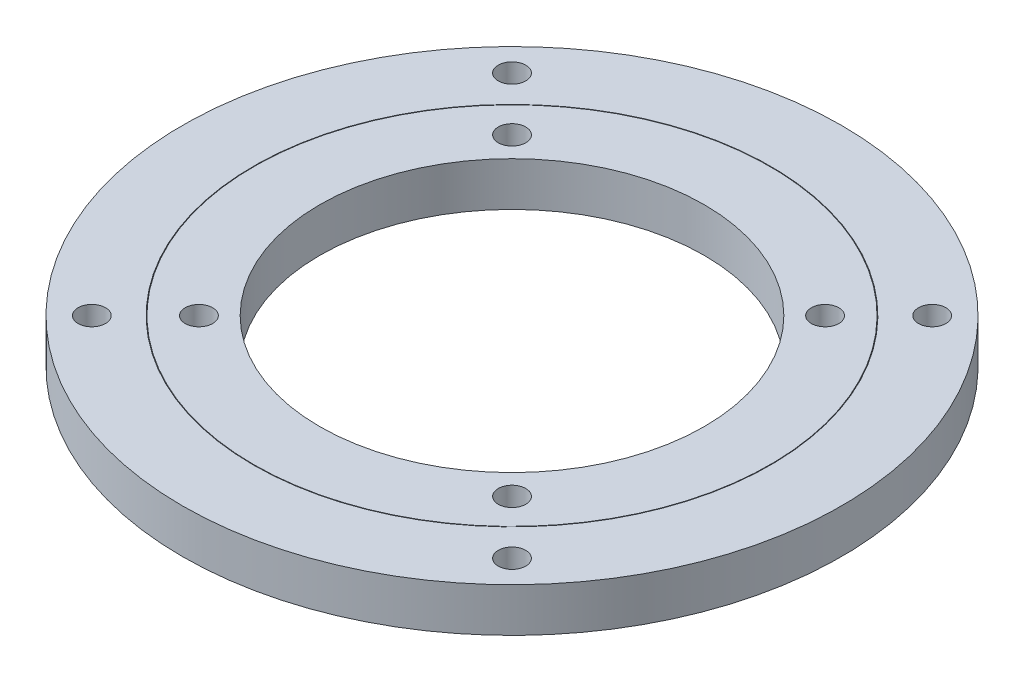
ISO-10303-21;
HEADER;
FILE_DESCRIPTION(('STEP AP214'),'2;1');
FILE_NAME('part.step','',(''),(''),'','','');
FILE_SCHEMA(('AUTOMOTIVE_DESIGN { 1 0 10303 214 1 1 1 1 }'));
ENDSEC;
DATA;
#1=APPLICATION_CONTEXT('core data for automotive mechanical design processes');
#2=APPLICATION_PROTOCOL_DEFINITION('international standard','automotive_design',2000,#1);
#3=PRODUCT_CONTEXT('',#1,'mechanical');
#4=PRODUCT('Part','Part','',(#3));
#5=PRODUCT_RELATED_PRODUCT_CATEGORY('part','',(#4));
#6=PRODUCT_DEFINITION_FORMATION('','',#4);
#7=PRODUCT_DEFINITION_CONTEXT('part definition',#1,'design');
#8=PRODUCT_DEFINITION('design','',#6,#7);
#9=PRODUCT_DEFINITION_SHAPE('','',#8);
#10=(LENGTH_UNIT() NAMED_UNIT(*) SI_UNIT(.MILLI.,.METRE.));
#11=(NAMED_UNIT(*) PLANE_ANGLE_UNIT() SI_UNIT($,.RADIAN.));
#12=(NAMED_UNIT(*) SI_UNIT($,.STERADIAN.) SOLID_ANGLE_UNIT());
#13=UNCERTAINTY_MEASURE_WITH_UNIT(LENGTH_MEASURE(1.E-05),#10,'distance_accuracy_value','');
#14=(GEOMETRIC_REPRESENTATION_CONTEXT(3) GLOBAL_UNCERTAINTY_ASSIGNED_CONTEXT((#13)) GLOBAL_UNIT_ASSIGNED_CONTEXT((#10,
#11,#12)) REPRESENTATION_CONTEXT('',''));
#15=CARTESIAN_POINT('',(0.,0.,0.));
#16=DIRECTION('',(0.,0.,1.));
#17=DIRECTION('',(1.,0.,0.));
#18=AXIS2_PLACEMENT_3D('',#15,#16,#17);
#19=CARTESIAN_POINT('',(0.,8.,0.));
#20=DIRECTION('',(0.,-1.,0.));
#21=DIRECTION('',(0.,0.,-1.));
#22=AXIS2_PLACEMENT_3D('',#19,#20,#21);
#23=CYLINDRICAL_SURFACE('',#22,60.);
#24=CARTESIAN_POINT('',(0.,8.,0.));
#25=DIRECTION('',(0.,1.,0.));
#26=DIRECTION('',(0.,0.,1.));
#27=AXIS2_PLACEMENT_3D('',#24,#25,#26);
#28=CIRCLE('',#27,60.);
#29=CARTESIAN_POINT('',(0.,8.,60.));
#30=VERTEX_POINT('',#29);
#31=EDGE_CURVE('E49',#30,#30,#28,.T.);
#32=ORIENTED_EDGE('',*,*,#31,.F.);
#33=EDGE_LOOP('',(#32));
#34=FACE_BOUND('',#33,.T.);
#35=CARTESIAN_POINT('',(0.,0.,0.));
#36=DIRECTION('',(0.,1.,0.));
#37=DIRECTION('',(0.,0.,1.));
#38=AXIS2_PLACEMENT_3D('',#35,#36,#37);
#39=CIRCLE('',#38,60.);
#40=CARTESIAN_POINT('',(0.,0.,60.));
#41=VERTEX_POINT('',#40);
#42=EDGE_CURVE('E69',#41,#41,#39,.T.);
#43=ORIENTED_EDGE('',*,*,#42,.T.);
#44=EDGE_LOOP('',(#43));
#45=FACE_BOUND('',#44,.T.);
#46=ADVANCED_FACE('F41',(#34,#45),#23,.T.);
#47=CARTESIAN_POINT('',(-38.25,8.,-38.25));
#48=DIRECTION('',(0.,-1.,0.));
#49=DIRECTION('',(0.,0.,-1.));
#50=AXIS2_PLACEMENT_3D('',#47,#48,#49);
#51=CYLINDRICAL_SURFACE('',#50,2.5);
#52=CARTESIAN_POINT('',(-38.25,8.,-38.25));
#53=DIRECTION('',(0.,1.,0.));
#54=DIRECTION('',(0.,0.,1.));
#55=AXIS2_PLACEMENT_3D('',#52,#53,#54);
#56=CIRCLE('',#55,2.5);
#57=CARTESIAN_POINT('',(-38.25,8.,-35.75));
#58=VERTEX_POINT('',#57);
#59=EDGE_CURVE('E54',#58,#58,#56,.T.);
#60=ORIENTED_EDGE('',*,*,#59,.T.);
#61=EDGE_LOOP('',(#60));
#62=FACE_BOUND('',#61,.T.);
#63=CARTESIAN_POINT('',(-38.25,0.,-38.25));
#64=DIRECTION('',(0.,1.,0.));
#65=DIRECTION('',(0.,0.,1.));
#66=AXIS2_PLACEMENT_3D('',#63,#64,#65);
#67=CIRCLE('',#66,2.5);
#68=CARTESIAN_POINT('',(-38.25,0.,-35.75));
#69=VERTEX_POINT('',#68);
#70=EDGE_CURVE('E67',#69,#69,#67,.T.);
#71=ORIENTED_EDGE('',*,*,#70,.F.);
#72=EDGE_LOOP('',(#71));
#73=FACE_BOUND('',#72,.T.);
#74=ADVANCED_FACE('F90',(#62,#73),#51,.F.);
#75=CARTESIAN_POINT('',(38.25,8.,-38.25));
#76=DIRECTION('',(0.,-1.,0.));
#77=DIRECTION('',(0.,0.,-1.));
#78=AXIS2_PLACEMENT_3D('',#75,#76,#77);
#79=CYLINDRICAL_SURFACE('',#78,2.5);
#80=CARTESIAN_POINT('',(38.25,8.,-38.25));
#81=DIRECTION('',(0.,1.,0.));
#82=DIRECTION('',(0.,0.,1.));
#83=AXIS2_PLACEMENT_3D('',#80,#81,#82);
#84=CIRCLE('',#83,2.5);
#85=CARTESIAN_POINT('',(38.25,8.,-35.75));
#86=VERTEX_POINT('',#85);
#87=EDGE_CURVE('E83',#86,#86,#84,.T.);
#88=ORIENTED_EDGE('',*,*,#87,.T.);
#89=EDGE_LOOP('',(#88));
#90=FACE_BOUND('',#89,.T.);
#91=CARTESIAN_POINT('',(38.25,0.,-38.25));
#92=DIRECTION('',(0.,1.,0.));
#93=DIRECTION('',(0.,0.,1.));
#94=AXIS2_PLACEMENT_3D('',#91,#92,#93);
#95=CIRCLE('',#94,2.5);
#96=CARTESIAN_POINT('',(38.25,0.,-35.75));
#97=VERTEX_POINT('',#96);
#98=EDGE_CURVE('E64',#97,#97,#95,.T.);
#99=ORIENTED_EDGE('',*,*,#98,.F.);
#100=EDGE_LOOP('',(#99));
#101=FACE_BOUND('',#100,.T.);
#102=ADVANCED_FACE('F107',(#90,#101),#79,.F.);
#103=CARTESIAN_POINT('',(38.25,8.,38.25));
#104=DIRECTION('',(0.,-1.,0.));
#105=DIRECTION('',(0.,0.,-1.));
#106=AXIS2_PLACEMENT_3D('',#103,#104,#105);
#107=CYLINDRICAL_SURFACE('',#106,2.5);
#108=CARTESIAN_POINT('',(38.25,8.,38.25));
#109=DIRECTION('',(0.,1.,0.));
#110=DIRECTION('',(0.,0.,1.));
#111=AXIS2_PLACEMENT_3D('',#108,#109,#110);
#112=CIRCLE('',#111,2.5);
#113=CARTESIAN_POINT('',(38.25,8.,40.75));
#114=VERTEX_POINT('',#113);
#115=EDGE_CURVE('E78',#114,#114,#112,.F.);
#116=ORIENTED_EDGE('',*,*,#115,.F.);
#117=EDGE_LOOP('',(#116));
#118=FACE_BOUND('',#117,.T.);
#119=CARTESIAN_POINT('',(38.25,0.,38.25));
#120=DIRECTION('',(0.,1.,0.));
#121=DIRECTION('',(0.,0.,1.));
#122=AXIS2_PLACEMENT_3D('',#119,#120,#121);
#123=CIRCLE('',#122,2.5);
#124=CARTESIAN_POINT('',(38.25,0.,40.75));
#125=VERTEX_POINT('',#124);
#126=EDGE_CURVE('E61',#125,#125,#123,.F.);
#127=ORIENTED_EDGE('',*,*,#126,.T.);
#128=EDGE_LOOP('',(#127));
#129=FACE_BOUND('',#128,.T.);
#130=ADVANCED_FACE('F113',(#118,#129),#107,.F.);
#131=CARTESIAN_POINT('',(0.,8.,0.));
#132=DIRECTION('',(0.,-1.,0.));
#133=DIRECTION('',(0.,0.,-1.));
#134=AXIS2_PLACEMENT_3D('',#131,#132,#133);
#135=CYLINDRICAL_SURFACE('',#134,47.1);
#136=CARTESIAN_POINT('',(0.,8.,0.));
#137=DIRECTION('',(0.,1.,0.));
#138=DIRECTION('',(0.,0.,1.));
#139=AXIS2_PLACEMENT_3D('',#136,#137,#138);
#140=CIRCLE('',#139,47.1);
#141=CARTESIAN_POINT('',(0.,8.,47.1));
#142=VERTEX_POINT('',#141);
#143=EDGE_CURVE('E74',#142,#142,#140,.T.);
#144=ORIENTED_EDGE('',*,*,#143,.T.);
#145=EDGE_LOOP('',(#144));
#146=FACE_BOUND('',#145,.T.);
#147=CARTESIAN_POINT('',(0.,0.,0.));
#148=DIRECTION('',(0.,1.,0.));
#149=DIRECTION('',(0.,0.,1.));
#150=AXIS2_PLACEMENT_3D('',#147,#148,#149);
#151=CIRCLE('',#150,47.1);
#152=CARTESIAN_POINT('',(0.,0.,47.1));
#153=VERTEX_POINT('',#152);
#154=EDGE_CURVE('E58',#153,#153,#151,.T.);
#155=ORIENTED_EDGE('',*,*,#154,.F.);
#156=EDGE_LOOP('',(#155));
#157=FACE_BOUND('',#156,.T.);
#158=ADVANCED_FACE('F43',(#146,#157),#135,.F.);
#159=CARTESIAN_POINT('',(-38.25,8.,38.25));
#160=DIRECTION('',(0.,-1.,0.));
#161=DIRECTION('',(0.,0.,-1.));
#162=AXIS2_PLACEMENT_3D('',#159,#160,#161);
#163=CYLINDRICAL_SURFACE('',#162,2.5);
#164=CARTESIAN_POINT('',(-38.25,8.,38.25));
#165=DIRECTION('',(0.,1.,0.));
#166=DIRECTION('',(0.,0.,1.));
#167=AXIS2_PLACEMENT_3D('',#164,#165,#166);
#168=CIRCLE('',#167,2.5);
#169=CARTESIAN_POINT('',(-38.25,8.,40.75));
#170=VERTEX_POINT('',#169);
#171=EDGE_CURVE('E11',#170,#170,#168,.F.);
#172=ORIENTED_EDGE('',*,*,#171,.F.);
#173=EDGE_LOOP('',(#172));
#174=FACE_BOUND('',#173,.T.);
#175=CARTESIAN_POINT('',(-38.25,0.,38.25));
#176=DIRECTION('',(0.,1.,0.));
#177=DIRECTION('',(0.,0.,1.));
#178=AXIS2_PLACEMENT_3D('',#175,#176,#177);
#179=CIRCLE('',#178,2.5);
#180=CARTESIAN_POINT('',(-38.25,0.,40.75));
#181=VERTEX_POINT('',#180);
#182=EDGE_CURVE('E45',#181,#181,#179,.F.);
#183=ORIENTED_EDGE('',*,*,#182,.T.);
#184=EDGE_LOOP('',(#183));
#185=FACE_BOUND('',#184,.T.);
#186=ADVANCED_FACE('F97',(#174,#185),#163,.F.);
#187=CARTESIAN_POINT('',(0.,8.,0.));
#188=DIRECTION('',(0.,1.,0.));
#189=DIRECTION('',(0.,0.,1.));
#190=AXIS2_PLACEMENT_3D('',#187,#188,#189);
#191=PLANE('',#190);
#192=ORIENTED_EDGE('',*,*,#143,.F.);
#193=EDGE_LOOP('',(#192));
#194=FACE_BOUND('',#193,.T.);
#195=ORIENTED_EDGE('',*,*,#115,.T.);
#196=EDGE_LOOP('',(#195));
#197=FACE_BOUND('',#196,.T.);
#198=ORIENTED_EDGE('',*,*,#87,.F.);
#199=EDGE_LOOP('',(#198));
#200=FACE_BOUND('',#199,.T.);
#201=ORIENTED_EDGE('',*,*,#59,.F.);
#202=EDGE_LOOP('',(#201));
#203=FACE_BOUND('',#202,.T.);
#204=ORIENTED_EDGE('',*,*,#31,.T.);
#205=EDGE_LOOP('',(#204));
#206=FACE_BOUND('',#205,.T.);
#207=ORIENTED_EDGE('',*,*,#171,.T.);
#208=EDGE_LOOP('',(#207));
#209=FACE_BOUND('',#208,.T.);
#210=ADVANCED_FACE('F93',(#194,#197,#200,#203,#206,#209),#191,.T.);
#211=CARTESIAN_POINT('',(0.,0.,0.));
#212=DIRECTION('',(0.,1.,0.));
#213=DIRECTION('',(0.,0.,1.));
#214=AXIS2_PLACEMENT_3D('',#211,#212,#213);
#215=PLANE('',#214);
#216=ORIENTED_EDGE('',*,*,#154,.T.);
#217=EDGE_LOOP('',(#216));
#218=FACE_BOUND('',#217,.T.);
#219=ORIENTED_EDGE('',*,*,#126,.F.);
#220=EDGE_LOOP('',(#219));
#221=FACE_BOUND('',#220,.T.);
#222=ORIENTED_EDGE('',*,*,#98,.T.);
#223=EDGE_LOOP('',(#222));
#224=FACE_BOUND('',#223,.T.);
#225=ORIENTED_EDGE('',*,*,#70,.T.);
#226=EDGE_LOOP('',(#225));
#227=FACE_BOUND('',#226,.T.);
#228=ORIENTED_EDGE('',*,*,#42,.F.);
#229=EDGE_LOOP('',(#228));
#230=FACE_BOUND('',#229,.T.);
#231=ORIENTED_EDGE('',*,*,#182,.F.);
#232=EDGE_LOOP('',(#231));
#233=FACE_BOUND('',#232,.T.);
#234=ADVANCED_FACE('F96',(#218,#221,#224,#227,#230,#233),#215,.F.);
#235=CLOSED_SHELL('',(#46,#74,#102,#130,#158,#186,#210,#234));
#236=MANIFOLD_SOLID_BREP('B2',#235);
#237=CARTESIAN_POINT('',(0.,8.,0.));
#238=DIRECTION('',(0.,-1.,0.));
#239=DIRECTION('',(0.,0.,-1.));
#240=AXIS2_PLACEMENT_3D('',#237,#238,#239);
#241=CYLINDRICAL_SURFACE('',#240,47.);
#242=CARTESIAN_POINT('',(0.,8.,0.));
#243=DIRECTION('',(0.,1.,0.));
#244=DIRECTION('',(0.,0.,1.));
#245=AXIS2_PLACEMENT_3D('',#242,#243,#244);
#246=CIRCLE('',#245,47.);
#247=CARTESIAN_POINT('',(0.,8.,47.));
#248=VERTEX_POINT('',#247);
#249=EDGE_CURVE('E195',#248,#248,#246,.T.);
#250=ORIENTED_EDGE('',*,*,#249,.F.);
#251=EDGE_LOOP('',(#250));
#252=FACE_BOUND('',#251,.T.);
#253=CARTESIAN_POINT('',(0.,0.,0.));
#254=DIRECTION('',(0.,1.,0.));
#255=DIRECTION('',(0.,0.,1.));
#256=AXIS2_PLACEMENT_3D('',#253,#254,#255);
#257=CIRCLE('',#256,47.);
#258=CARTESIAN_POINT('',(0.,0.,47.));
#259=VERTEX_POINT('',#258);
#260=EDGE_CURVE('E215',#259,#259,#257,.T.);
#261=ORIENTED_EDGE('',*,*,#260,.T.);
#262=EDGE_LOOP('',(#261));
#263=FACE_BOUND('',#262,.T.);
#264=ADVANCED_FACE('F187',(#252,#263),#241,.T.);
#265=CARTESIAN_POINT('',(0.,8.,0.));
#266=DIRECTION('',(0.,-1.,0.));
#267=DIRECTION('',(0.,0.,-1.));
#268=AXIS2_PLACEMENT_3D('',#265,#266,#267);
#269=CYLINDRICAL_SURFACE('',#268,35.);
#270=CARTESIAN_POINT('',(0.,8.,0.));
#271=DIRECTION('',(0.,1.,0.));
#272=DIRECTION('',(0.,0.,1.));
#273=AXIS2_PLACEMENT_3D('',#270,#271,#272);
#274=CIRCLE('',#273,35.);
#275=CARTESIAN_POINT('',(0.,8.,35.));
#276=VERTEX_POINT('',#275);
#277=EDGE_CURVE('E200',#276,#276,#274,.T.);
#278=ORIENTED_EDGE('',*,*,#277,.T.);
#279=EDGE_LOOP('',(#278));
#280=FACE_BOUND('',#279,.T.);
#281=CARTESIAN_POINT('',(0.,0.,0.));
#282=DIRECTION('',(0.,1.,0.));
#283=DIRECTION('',(0.,0.,1.));
#284=AXIS2_PLACEMENT_3D('',#281,#282,#283);
#285=CIRCLE('',#284,35.);
#286=CARTESIAN_POINT('',(0.,0.,35.));
#287=VERTEX_POINT('',#286);
#288=EDGE_CURVE('E213',#287,#287,#285,.T.);
#289=ORIENTED_EDGE('',*,*,#288,.F.);
#290=EDGE_LOOP('',(#289));
#291=FACE_BOUND('',#290,.T.);
#292=ADVANCED_FACE('F236',(#280,#291),#269,.F.);
#293=CARTESIAN_POINT('',(28.5,8.,-28.5));
#294=DIRECTION('',(0.,-1.,0.));
#295=DIRECTION('',(0.,0.,-1.));
#296=AXIS2_PLACEMENT_3D('',#293,#294,#295);
#297=CYLINDRICAL_SURFACE('',#296,2.5);
#298=CARTESIAN_POINT('',(28.5,8.,-28.5));
#299=DIRECTION('',(0.,1.,0.));
#300=DIRECTION('',(0.,0.,1.));
#301=AXIS2_PLACEMENT_3D('',#298,#299,#300);
#302=CIRCLE('',#301,2.5);
#303=CARTESIAN_POINT('',(28.5,8.,-26.));
#304=VERTEX_POINT('',#303);
#305=EDGE_CURVE('E229',#304,#304,#302,.T.);
#306=ORIENTED_EDGE('',*,*,#305,.T.);
#307=EDGE_LOOP('',(#306));
#308=FACE_BOUND('',#307,.T.);
#309=CARTESIAN_POINT('',(28.5,0.,-28.5));
#310=DIRECTION('',(0.,1.,0.));
#311=DIRECTION('',(0.,0.,1.));
#312=AXIS2_PLACEMENT_3D('',#309,#310,#311);
#313=CIRCLE('',#312,2.5);
#314=CARTESIAN_POINT('',(28.5,0.,-26.));
#315=VERTEX_POINT('',#314);
#316=EDGE_CURVE('E210',#315,#315,#313,.T.);
#317=ORIENTED_EDGE('',*,*,#316,.F.);
#318=EDGE_LOOP('',(#317));
#319=FACE_BOUND('',#318,.T.);
#320=ADVANCED_FACE('F252',(#308,#319),#297,.F.);
#321=CARTESIAN_POINT('',(-28.5,8.,-28.5));
#322=DIRECTION('',(0.,-1.,0.));
#323=DIRECTION('',(0.,0.,-1.));
#324=AXIS2_PLACEMENT_3D('',#321,#322,#323);
#325=CYLINDRICAL_SURFACE('',#324,2.5);
#326=CARTESIAN_POINT('',(-28.5,8.,-28.5));
#327=DIRECTION('',(0.,1.,0.));
#328=DIRECTION('',(0.,0.,1.));
#329=AXIS2_PLACEMENT_3D('',#326,#327,#328);
#330=CIRCLE('',#329,2.5);
#331=CARTESIAN_POINT('',(-28.5,8.,-26.));
#332=VERTEX_POINT('',#331);
#333=EDGE_CURVE('E224',#332,#332,#330,.T.);
#334=ORIENTED_EDGE('',*,*,#333,.T.);
#335=EDGE_LOOP('',(#334));
#336=FACE_BOUND('',#335,.T.);
#337=CARTESIAN_POINT('',(-28.5,0.,-28.5));
#338=DIRECTION('',(0.,1.,0.));
#339=DIRECTION('',(0.,0.,1.));
#340=AXIS2_PLACEMENT_3D('',#337,#338,#339);
#341=CIRCLE('',#340,2.5);
#342=CARTESIAN_POINT('',(-28.5,0.,-26.));
#343=VERTEX_POINT('',#342);
#344=EDGE_CURVE('E207',#343,#343,#341,.T.);
#345=ORIENTED_EDGE('',*,*,#344,.F.);
#346=EDGE_LOOP('',(#345));
#347=FACE_BOUND('',#346,.T.);
#348=ADVANCED_FACE('F258',(#336,#347),#325,.F.);
#349=CARTESIAN_POINT('',(28.5,8.,28.5));
#350=DIRECTION('',(0.,-1.,0.));
#351=DIRECTION('',(0.,0.,-1.));
#352=AXIS2_PLACEMENT_3D('',#349,#350,#351);
#353=CYLINDRICAL_SURFACE('',#352,2.49999999999999);
#354=CARTESIAN_POINT('',(28.5,8.,28.5));
#355=DIRECTION('',(0.,1.,0.));
#356=DIRECTION('',(0.,0.,1.));
#357=AXIS2_PLACEMENT_3D('',#354,#355,#356);
#358=CIRCLE('',#357,2.49999999999999);
#359=CARTESIAN_POINT('',(28.5,8.,31.));
#360=VERTEX_POINT('',#359);
#361=EDGE_CURVE('E220',#360,#360,#358,.F.);
#362=ORIENTED_EDGE('',*,*,#361,.F.);
#363=EDGE_LOOP('',(#362));
#364=FACE_BOUND('',#363,.T.);
#365=CARTESIAN_POINT('',(28.5,0.,28.5));
#366=DIRECTION('',(0.,1.,0.));
#367=DIRECTION('',(0.,0.,1.));
#368=AXIS2_PLACEMENT_3D('',#365,#366,#367);
#369=CIRCLE('',#368,2.49999999999999);
#370=CARTESIAN_POINT('',(28.5,0.,31.));
#371=VERTEX_POINT('',#370);
#372=EDGE_CURVE('E204',#371,#371,#369,.F.);
#373=ORIENTED_EDGE('',*,*,#372,.T.);
#374=EDGE_LOOP('',(#373));
#375=FACE_BOUND('',#374,.T.);
#376=ADVANCED_FACE('F189',(#364,#375),#353,.F.);
#377=CARTESIAN_POINT('',(-28.5,8.,28.5));
#378=DIRECTION('',(0.,-1.,0.));
#379=DIRECTION('',(0.,0.,-1.));
#380=AXIS2_PLACEMENT_3D('',#377,#378,#379);
#381=CYLINDRICAL_SURFACE('',#380,2.49999999999999);
#382=CARTESIAN_POINT('',(-28.5,8.,28.5));
#383=DIRECTION('',(0.,1.,0.));
#384=DIRECTION('',(0.,0.,1.));
#385=AXIS2_PLACEMENT_3D('',#382,#383,#384);
#386=CIRCLE('',#385,2.49999999999999);
#387=CARTESIAN_POINT('',(-28.5,8.,31.));
#388=VERTEX_POINT('',#387);
#389=EDGE_CURVE('E40',#388,#388,#386,.F.);
#390=ORIENTED_EDGE('',*,*,#389,.F.);
#391=EDGE_LOOP('',(#390));
#392=FACE_BOUND('',#391,.T.);
#393=CARTESIAN_POINT('',(-28.5,0.,28.5));
#394=DIRECTION('',(0.,1.,0.));
#395=DIRECTION('',(0.,0.,1.));
#396=AXIS2_PLACEMENT_3D('',#393,#394,#395);
#397=CIRCLE('',#396,2.49999999999999);
#398=CARTESIAN_POINT('',(-28.5,0.,31.));
#399=VERTEX_POINT('',#398);
#400=EDGE_CURVE('E191',#399,#399,#397,.F.);
#401=ORIENTED_EDGE('',*,*,#400,.T.);
#402=EDGE_LOOP('',(#401));
#403=FACE_BOUND('',#402,.T.);
#404=ADVANCED_FACE('F243',(#392,#403),#381,.F.);
#405=CARTESIAN_POINT('',(0.,8.,0.));
#406=DIRECTION('',(0.,1.,0.));
#407=DIRECTION('',(0.,0.,1.));
#408=AXIS2_PLACEMENT_3D('',#405,#406,#407);
#409=PLANE('',#408);
#410=ORIENTED_EDGE('',*,*,#361,.T.);
#411=EDGE_LOOP('',(#410));
#412=FACE_BOUND('',#411,.T.);
#413=ORIENTED_EDGE('',*,*,#333,.F.);
#414=EDGE_LOOP('',(#413));
#415=FACE_BOUND('',#414,.T.);
#416=ORIENTED_EDGE('',*,*,#305,.F.);
#417=EDGE_LOOP('',(#416));
#418=FACE_BOUND('',#417,.T.);
#419=ORIENTED_EDGE('',*,*,#277,.F.);
#420=EDGE_LOOP('',(#419));
#421=FACE_BOUND('',#420,.T.);
#422=ORIENTED_EDGE('',*,*,#249,.T.);
#423=EDGE_LOOP('',(#422));
#424=FACE_BOUND('',#423,.T.);
#425=ORIENTED_EDGE('',*,*,#389,.T.);
#426=EDGE_LOOP('',(#425));
#427=FACE_BOUND('',#426,.T.);
#428=ADVANCED_FACE('F239',(#412,#415,#418,#421,#424,#427),#409,.T.);
#429=CARTESIAN_POINT('',(0.,0.,0.));
#430=DIRECTION('',(0.,1.,0.));
#431=DIRECTION('',(0.,0.,1.));
#432=AXIS2_PLACEMENT_3D('',#429,#430,#431);
#433=PLANE('',#432);
#434=ORIENTED_EDGE('',*,*,#372,.F.);
#435=EDGE_LOOP('',(#434));
#436=FACE_BOUND('',#435,.T.);
#437=ORIENTED_EDGE('',*,*,#344,.T.);
#438=EDGE_LOOP('',(#437));
#439=FACE_BOUND('',#438,.T.);
#440=ORIENTED_EDGE('',*,*,#316,.T.);
#441=EDGE_LOOP('',(#440));
#442=FACE_BOUND('',#441,.T.);
#443=ORIENTED_EDGE('',*,*,#288,.T.);
#444=EDGE_LOOP('',(#443));
#445=FACE_BOUND('',#444,.T.);
#446=ORIENTED_EDGE('',*,*,#260,.F.);
#447=EDGE_LOOP('',(#446));
#448=FACE_BOUND('',#447,.T.);
#449=ORIENTED_EDGE('',*,*,#400,.F.);
#450=EDGE_LOOP('',(#449));
#451=FACE_BOUND('',#450,.T.);
#452=ADVANCED_FACE('F242',(#436,#439,#442,#445,#448,#451),#433,.F.);
#453=CLOSED_SHELL('',(#264,#292,#320,#348,#376,#404,#428,#452));
#454=MANIFOLD_SOLID_BREP('B6',#453);
#455=ADVANCED_BREP_SHAPE_REPRESENTATION('',(#18,#236,#454),#14);
#456=SHAPE_DEFINITION_REPRESENTATION(#9,#455);
ENDSEC;
END-ISO-10303-21;
